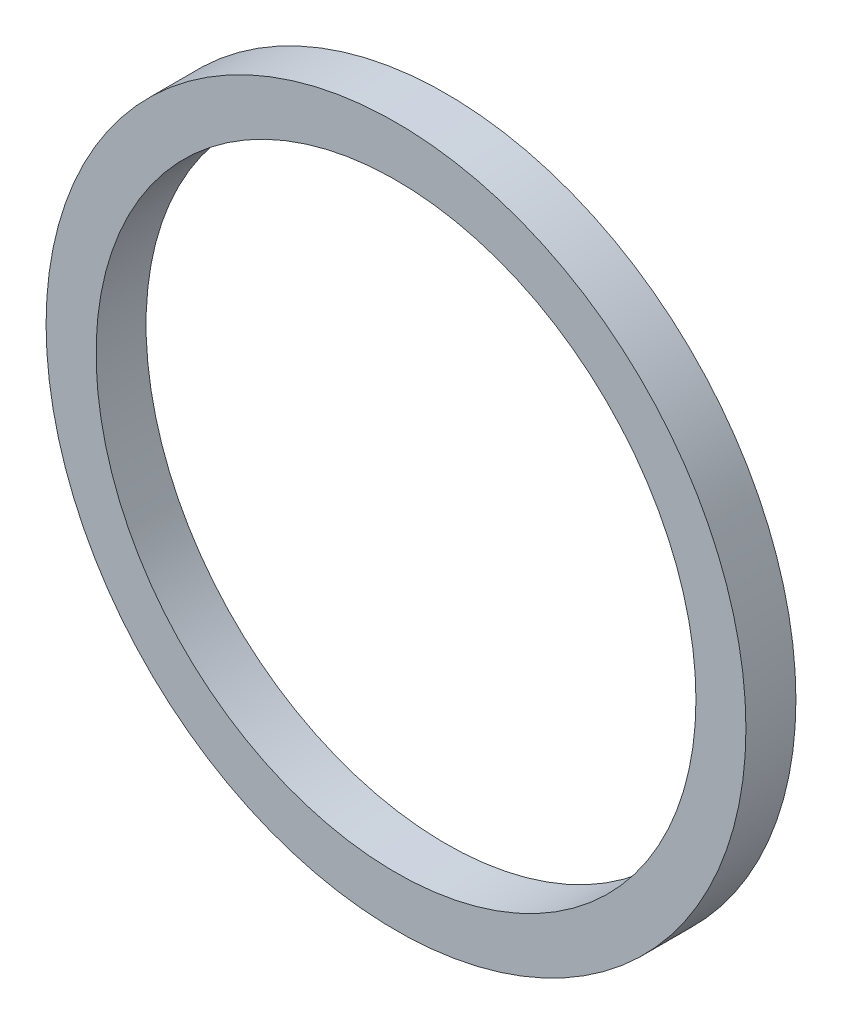
ISO-10303-21;
HEADER;
FILE_DESCRIPTION(('STEP AP214'),'2;1');
FILE_NAME('part.step','',(''),(''),'','','');
FILE_SCHEMA(('AUTOMOTIVE_DESIGN { 1 0 10303 214 1 1 1 1 }'));
ENDSEC;
DATA;
#1=APPLICATION_CONTEXT('core data for automotive mechanical design processes');
#2=APPLICATION_PROTOCOL_DEFINITION('international standard','automotive_design',2000,#1);
#3=PRODUCT_CONTEXT('',#1,'mechanical');
#4=PRODUCT('Part','Part','',(#3));
#5=PRODUCT_RELATED_PRODUCT_CATEGORY('part','',(#4));
#6=PRODUCT_DEFINITION_FORMATION('','',#4);
#7=PRODUCT_DEFINITION_CONTEXT('part definition',#1,'design');
#8=PRODUCT_DEFINITION('design','',#6,#7);
#9=PRODUCT_DEFINITION_SHAPE('','',#8);
#10=(LENGTH_UNIT() NAMED_UNIT(*) SI_UNIT(.MILLI.,.METRE.));
#11=(NAMED_UNIT(*) PLANE_ANGLE_UNIT() SI_UNIT($,.RADIAN.));
#12=(NAMED_UNIT(*) SI_UNIT($,.STERADIAN.) SOLID_ANGLE_UNIT());
#13=UNCERTAINTY_MEASURE_WITH_UNIT(LENGTH_MEASURE(1.E-05),#10,'distance_accuracy_value','');
#14=(GEOMETRIC_REPRESENTATION_CONTEXT(3) GLOBAL_UNCERTAINTY_ASSIGNED_CONTEXT((#13)) GLOBAL_UNIT_ASSIGNED_CONTEXT((#10,
#11,#12)) REPRESENTATION_CONTEXT('',''));
#15=CARTESIAN_POINT('',(0.,0.,0.));
#16=DIRECTION('',(0.,0.,1.));
#17=DIRECTION('',(1.,0.,0.));
#18=AXIS2_PLACEMENT_3D('',#15,#16,#17);
#19=CARTESIAN_POINT('',(0.,0.,5.));
#20=DIRECTION('',(0.,0.,1.));
#21=DIRECTION('',(1.,0.,0.));
#22=AXIS2_PLACEMENT_3D('',#19,#20,#21);
#23=PLANE('',#22);
#24=CARTESIAN_POINT('',(0.,0.,5.));
#25=DIRECTION('',(0.,0.,1.));
#26=DIRECTION('',(1.,0.,0.));
#27=AXIS2_PLACEMENT_3D('',#24,#25,#26);
#28=CIRCLE('',#27,35.);
#29=CARTESIAN_POINT('',(35.,0.,5.));
#30=VERTEX_POINT('',#29);
#31=EDGE_CURVE('E10',#30,#30,#28,.T.);
#32=ORIENTED_EDGE('',*,*,#31,.T.);
#33=EDGE_LOOP('',(#32));
#34=FACE_BOUND('',#33,.T.);
#35=CARTESIAN_POINT('',(0.,0.,5.));
#36=DIRECTION('',(0.,0.,1.));
#37=DIRECTION('',(1.,0.,0.));
#38=AXIS2_PLACEMENT_3D('',#35,#36,#37);
#39=CIRCLE('',#38,30.);
#40=CARTESIAN_POINT('',(30.,0.,5.));
#41=VERTEX_POINT('',#40);
#42=EDGE_CURVE('E51',#41,#41,#39,.T.);
#43=ORIENTED_EDGE('',*,*,#42,.F.);
#44=EDGE_LOOP('',(#43));
#45=FACE_BOUND('',#44,.T.);
#46=ADVANCED_FACE('F38',(#34,#45),#23,.T.);
#47=CARTESIAN_POINT('',(0.,0.,0.));
#48=DIRECTION('',(0.,0.,1.));
#49=DIRECTION('',(1.,0.,0.));
#50=AXIS2_PLACEMENT_3D('',#47,#48,#49);
#51=PLANE('',#50);
#52=CARTESIAN_POINT('',(0.,0.,0.));
#53=DIRECTION('',(0.,0.,1.));
#54=DIRECTION('',(1.,0.,0.));
#55=AXIS2_PLACEMENT_3D('',#52,#53,#54);
#56=CIRCLE('',#55,35.);
#57=CARTESIAN_POINT('',(35.,0.,0.));
#58=VERTEX_POINT('',#57);
#59=EDGE_CURVE('E42',#58,#58,#56,.T.);
#60=ORIENTED_EDGE('',*,*,#59,.F.);
#61=EDGE_LOOP('',(#60));
#62=FACE_BOUND('',#61,.T.);
#63=CARTESIAN_POINT('',(0.,0.,0.));
#64=DIRECTION('',(0.,0.,1.));
#65=DIRECTION('',(1.,0.,0.));
#66=AXIS2_PLACEMENT_3D('',#63,#64,#65);
#67=CIRCLE('',#66,30.);
#68=CARTESIAN_POINT('',(30.,0.,0.));
#69=VERTEX_POINT('',#68);
#70=EDGE_CURVE('E53',#69,#69,#67,.T.);
#71=ORIENTED_EDGE('',*,*,#70,.T.);
#72=EDGE_LOOP('',(#71));
#73=FACE_BOUND('',#72,.T.);
#74=ADVANCED_FACE('F65',(#62,#73),#51,.F.);
#75=CARTESIAN_POINT('',(0.,0.,5.));
#76=DIRECTION('',(0.,0.,-1.));
#77=DIRECTION('',(-1.,0.,0.));
#78=AXIS2_PLACEMENT_3D('',#75,#76,#77);
#79=CYLINDRICAL_SURFACE('',#78,35.);
#80=ORIENTED_EDGE('',*,*,#31,.F.);
#81=EDGE_LOOP('',(#80));
#82=FACE_BOUND('',#81,.T.);
#83=ORIENTED_EDGE('',*,*,#59,.T.);
#84=EDGE_LOOP('',(#83));
#85=FACE_BOUND('',#84,.T.);
#86=ADVANCED_FACE('F40',(#82,#85),#79,.T.);
#87=CARTESIAN_POINT('',(0.,0.,5.));
#88=DIRECTION('',(0.,0.,-1.));
#89=DIRECTION('',(-1.,0.,0.));
#90=AXIS2_PLACEMENT_3D('',#87,#88,#89);
#91=CYLINDRICAL_SURFACE('',#90,30.);
#92=ORIENTED_EDGE('',*,*,#42,.T.);
#93=EDGE_LOOP('',(#92));
#94=FACE_BOUND('',#93,.T.);
#95=ORIENTED_EDGE('',*,*,#70,.F.);
#96=EDGE_LOOP('',(#95));
#97=FACE_BOUND('',#96,.T.);
#98=ADVANCED_FACE('F61',(#94,#97),#91,.F.);
#99=CLOSED_SHELL('',(#46,#74,#86,#98));
#100=MANIFOLD_SOLID_BREP('B2',#99);
#101=ADVANCED_BREP_SHAPE_REPRESENTATION('',(#18,#100),#14);
#102=SHAPE_DEFINITION_REPRESENTATION(#9,#101);
ENDSEC;
END-ISO-10303-21;
